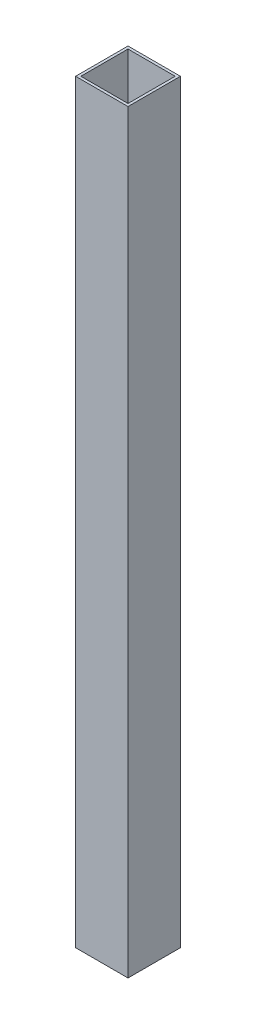
ISO-10303-21;
HEADER;
FILE_DESCRIPTION(('STEP AP214'),'2;1');
FILE_NAME('part.step','',(''),(''),'','','');
FILE_SCHEMA(('AUTOMOTIVE_DESIGN { 1 0 10303 214 1 1 1 1 }'));
ENDSEC;
DATA;
#1=APPLICATION_CONTEXT('core data for automotive mechanical design processes');
#2=APPLICATION_PROTOCOL_DEFINITION('international standard','automotive_design',2000,#1);
#3=PRODUCT_CONTEXT('',#1,'mechanical');
#4=PRODUCT('Part','Part','',(#3));
#5=PRODUCT_RELATED_PRODUCT_CATEGORY('part','',(#4));
#6=PRODUCT_DEFINITION_FORMATION('','',#4);
#7=PRODUCT_DEFINITION_CONTEXT('part definition',#1,'design');
#8=PRODUCT_DEFINITION('design','',#6,#7);
#9=PRODUCT_DEFINITION_SHAPE('','',#8);
#10=(LENGTH_UNIT() NAMED_UNIT(*) SI_UNIT(.MILLI.,.METRE.));
#11=(NAMED_UNIT(*) PLANE_ANGLE_UNIT() SI_UNIT($,.RADIAN.));
#12=(NAMED_UNIT(*) SI_UNIT($,.STERADIAN.) SOLID_ANGLE_UNIT());
#13=UNCERTAINTY_MEASURE_WITH_UNIT(LENGTH_MEASURE(1.E-05),#10,'distance_accuracy_value','');
#14=(GEOMETRIC_REPRESENTATION_CONTEXT(3) GLOBAL_UNCERTAINTY_ASSIGNED_CONTEXT((#13)) GLOBAL_UNIT_ASSIGNED_CONTEXT((#10,
#11,#12)) REPRESENTATION_CONTEXT('',''));
#15=CARTESIAN_POINT('',(0.,0.,0.));
#16=DIRECTION('',(0.,0.,1.));
#17=DIRECTION('',(1.,0.,0.));
#18=AXIS2_PLACEMENT_3D('',#15,#16,#17);
#19=CARTESIAN_POINT('',(0.,360.,0.));
#20=DIRECTION('',(0.,1.,0.));
#21=DIRECTION('',(0.,0.,1.));
#22=AXIS2_PLACEMENT_3D('',#19,#20,#21);
#23=PLANE('',#22);
#24=DIRECTION('',(0.,0.,-1.));
#25=VECTOR('',#24,1.);
#26=CARTESIAN_POINT('',(12.5,360.,-12.5));
#27=LINE('',#26,#25);
#28=CARTESIAN_POINT('',(12.5,360.,12.5));
#29=VERTEX_POINT('',#28);
#30=CARTESIAN_POINT('',(12.5,360.,-12.5));
#31=VERTEX_POINT('',#30);
#32=EDGE_CURVE('E136',#29,#31,#27,.T.);
#33=ORIENTED_EDGE('',*,*,#32,.T.);
#34=DIRECTION('',(-1.,0.,0.));
#35=VECTOR('',#34,1.);
#36=CARTESIAN_POINT('',(-12.5,360.,-12.5));
#37=LINE('',#36,#35);
#38=CARTESIAN_POINT('',(-12.5,360.,-12.5));
#39=VERTEX_POINT('',#38);
#40=EDGE_CURVE('E139',#31,#39,#37,.T.);
#41=ORIENTED_EDGE('',*,*,#40,.T.);
#42=DIRECTION('',(0.,0.,1.));
#43=VECTOR('',#42,1.);
#44=CARTESIAN_POINT('',(-12.5,360.,-12.5));
#45=LINE('',#44,#43);
#46=CARTESIAN_POINT('',(-12.5,360.,12.5));
#47=VERTEX_POINT('',#46);
#48=EDGE_CURVE('E142',#39,#47,#45,.T.);
#49=ORIENTED_EDGE('',*,*,#48,.T.);
#50=DIRECTION('',(1.,0.,0.));
#51=VECTOR('',#50,1.);
#52=CARTESIAN_POINT('',(-12.5,360.,12.5));
#53=LINE('',#52,#51);
#54=EDGE_CURVE('E144',#47,#29,#53,.T.);
#55=ORIENTED_EDGE('',*,*,#54,.T.);
#56=EDGE_LOOP('',(#33,#41,#49,#55));
#57=FACE_BOUND('',#56,.T.);
#58=DIRECTION('',(1.,0.,0.));
#59=VECTOR('',#58,1.);
#60=CARTESIAN_POINT('',(11.2504266533904,360.,11.2504266533904));
#61=LINE('',#60,#59);
#62=CARTESIAN_POINT('',(-11.2504266533904,360.,11.2504266533904));
#63=VERTEX_POINT('',#62);
#64=CARTESIAN_POINT('',(11.2504266533904,360.,11.2504266533904));
#65=VERTEX_POINT('',#64);
#66=EDGE_CURVE('E108',#63,#65,#61,.T.);
#67=ORIENTED_EDGE('',*,*,#66,.F.);
#68=DIRECTION('',(0.,0.,1.));
#69=VECTOR('',#68,1.);
#70=CARTESIAN_POINT('',(-11.2504266533904,360.,-11.2504266533904));
#71=LINE('',#70,#69);
#72=CARTESIAN_POINT('',(-11.2504266533904,360.,-11.2504266533904));
#73=VERTEX_POINT('',#72);
#74=EDGE_CURVE('E100',#73,#63,#71,.T.);
#75=ORIENTED_EDGE('',*,*,#74,.F.);
#76=DIRECTION('',(-1.,0.,0.));
#77=VECTOR('',#76,1.);
#78=CARTESIAN_POINT('',(11.2504266533904,360.,-11.2504266533904));
#79=LINE('',#78,#77);
#80=CARTESIAN_POINT('',(11.2504266533904,360.,-11.2504266533904));
#81=VERTEX_POINT('',#80);
#82=EDGE_CURVE('E122',#81,#73,#79,.T.);
#83=ORIENTED_EDGE('',*,*,#82,.F.);
#84=DIRECTION('',(0.,0.,-1.));
#85=VECTOR('',#84,1.);
#86=CARTESIAN_POINT('',(11.2504266533904,360.,-11.2504266533904));
#87=LINE('',#86,#85);
#88=EDGE_CURVE('E120',#65,#81,#87,.T.);
#89=ORIENTED_EDGE('',*,*,#88,.F.);
#90=EDGE_LOOP('',(#67,#75,#83,#89));
#91=FACE_BOUND('',#90,.T.);
#92=ADVANCED_FACE('F35',(#57,#91),#23,.T.);
#93=CARTESIAN_POINT('',(0.,0.,0.));
#94=DIRECTION('',(0.,1.,0.));
#95=DIRECTION('',(0.,0.,1.));
#96=AXIS2_PLACEMENT_3D('',#93,#94,#95);
#97=PLANE('',#96);
#98=DIRECTION('',(0.,0.,-1.));
#99=VECTOR('',#98,1.);
#100=CARTESIAN_POINT('',(12.5,0.,-12.5));
#101=LINE('',#100,#99);
#102=CARTESIAN_POINT('',(12.5,0.,12.5));
#103=VERTEX_POINT('',#102);
#104=CARTESIAN_POINT('',(12.5,0.,-12.5));
#105=VERTEX_POINT('',#104);
#106=EDGE_CURVE('E116',#103,#105,#101,.T.);
#107=ORIENTED_EDGE('',*,*,#106,.F.);
#108=DIRECTION('',(1.,0.,0.));
#109=VECTOR('',#108,1.);
#110=CARTESIAN_POINT('',(-12.5,0.,12.5));
#111=LINE('',#110,#109);
#112=CARTESIAN_POINT('',(-12.5,0.,12.5));
#113=VERTEX_POINT('',#112);
#114=EDGE_CURVE('E140',#113,#103,#111,.T.);
#115=ORIENTED_EDGE('',*,*,#114,.F.);
#116=DIRECTION('',(0.,0.,1.));
#117=VECTOR('',#116,1.);
#118=CARTESIAN_POINT('',(-12.5,0.,-12.5));
#119=LINE('',#118,#117);
#120=CARTESIAN_POINT('',(-12.5,0.,-12.5));
#121=VERTEX_POINT('',#120);
#122=EDGE_CURVE('E151',#121,#113,#119,.T.);
#123=ORIENTED_EDGE('',*,*,#122,.F.);
#124=DIRECTION('',(-1.,0.,0.));
#125=VECTOR('',#124,1.);
#126=CARTESIAN_POINT('',(-12.5,0.,-12.5));
#127=LINE('',#126,#125);
#128=EDGE_CURVE('E149',#105,#121,#127,.T.);
#129=ORIENTED_EDGE('',*,*,#128,.F.);
#130=EDGE_LOOP('',(#107,#115,#123,#129));
#131=FACE_BOUND('',#130,.T.);
#132=DIRECTION('',(0.,0.,1.));
#133=VECTOR('',#132,1.);
#134=CARTESIAN_POINT('',(-11.2504266533904,0.,-11.2504266533904));
#135=LINE('',#134,#133);
#136=CARTESIAN_POINT('',(-11.2504266533904,0.,-11.2504266533904));
#137=VERTEX_POINT('',#136);
#138=CARTESIAN_POINT('',(-11.2504266533904,0.,11.2504266533904));
#139=VERTEX_POINT('',#138);
#140=EDGE_CURVE('E58',#137,#139,#135,.T.);
#141=ORIENTED_EDGE('',*,*,#140,.T.);
#142=DIRECTION('',(1.,0.,0.));
#143=VECTOR('',#142,1.);
#144=CARTESIAN_POINT('',(11.2504266533904,0.,11.2504266533904));
#145=LINE('',#144,#143);
#146=CARTESIAN_POINT('',(11.2504266533904,0.,11.2504266533904));
#147=VERTEX_POINT('',#146);
#148=EDGE_CURVE('E115',#139,#147,#145,.T.);
#149=ORIENTED_EDGE('',*,*,#148,.T.);
#150=DIRECTION('',(0.,0.,-1.));
#151=VECTOR('',#150,1.);
#152=CARTESIAN_POINT('',(11.2504266533904,0.,-11.2504266533904));
#153=LINE('',#152,#151);
#154=CARTESIAN_POINT('',(11.2504266533904,0.,-11.2504266533904));
#155=VERTEX_POINT('',#154);
#156=EDGE_CURVE('E128',#147,#155,#153,.T.);
#157=ORIENTED_EDGE('',*,*,#156,.T.);
#158=DIRECTION('',(-1.,0.,0.));
#159=VECTOR('',#158,1.);
#160=CARTESIAN_POINT('',(11.2504266533904,0.,-11.2504266533904));
#161=LINE('',#160,#159);
#162=EDGE_CURVE('E109',#155,#137,#161,.T.);
#163=ORIENTED_EDGE('',*,*,#162,.T.);
#164=EDGE_LOOP('',(#141,#149,#157,#163));
#165=FACE_BOUND('',#164,.T.);
#166=ADVANCED_FACE('F169',(#131,#165),#97,.F.);
#167=CARTESIAN_POINT('',(12.5,360.,-12.5));
#168=DIRECTION('',(-1.,0.,0.));
#169=DIRECTION('',(0.,0.,1.));
#170=AXIS2_PLACEMENT_3D('',#167,#168,#169);
#171=PLANE('',#170);
#172=ORIENTED_EDGE('',*,*,#106,.T.);
#173=DIRECTION('',(0.,-1.,0.));
#174=VECTOR('',#173,1.);
#175=CARTESIAN_POINT('',(12.5,360.,-12.5));
#176=LINE('',#175,#174);
#177=EDGE_CURVE('E11',#31,#105,#176,.T.);
#178=ORIENTED_EDGE('',*,*,#177,.F.);
#179=ORIENTED_EDGE('',*,*,#32,.F.);
#180=DIRECTION('',(0.,-1.,0.));
#181=VECTOR('',#180,1.);
#182=CARTESIAN_POINT('',(12.5,360.,12.5));
#183=LINE('',#182,#181);
#184=EDGE_CURVE('E146',#29,#103,#183,.T.);
#185=ORIENTED_EDGE('',*,*,#184,.T.);
#186=EDGE_LOOP('',(#172,#178,#179,#185));
#187=FACE_BOUND('',#186,.T.);
#188=ADVANCED_FACE('F37',(#187),#171,.F.);
#189=CARTESIAN_POINT('',(-12.5,360.,-12.5));
#190=DIRECTION('',(0.,0.,1.));
#191=DIRECTION('',(1.,0.,0.));
#192=AXIS2_PLACEMENT_3D('',#189,#190,#191);
#193=PLANE('',#192);
#194=ORIENTED_EDGE('',*,*,#128,.T.);
#195=DIRECTION('',(0.,-1.,0.));
#196=VECTOR('',#195,1.);
#197=CARTESIAN_POINT('',(-12.5,360.,-12.5));
#198=LINE('',#197,#196);
#199=EDGE_CURVE('E43',#39,#121,#198,.T.);
#200=ORIENTED_EDGE('',*,*,#199,.F.);
#201=ORIENTED_EDGE('',*,*,#40,.F.);
#202=ORIENTED_EDGE('',*,*,#177,.T.);
#203=EDGE_LOOP('',(#194,#200,#201,#202));
#204=FACE_BOUND('',#203,.T.);
#205=ADVANCED_FACE('F179',(#204),#193,.F.);
#206=CARTESIAN_POINT('',(-12.5,360.,-12.5));
#207=DIRECTION('',(1.,0.,0.));
#208=DIRECTION('',(0.,0.,-1.));
#209=AXIS2_PLACEMENT_3D('',#206,#207,#208);
#210=PLANE('',#209);
#211=ORIENTED_EDGE('',*,*,#122,.T.);
#212=DIRECTION('',(0.,-1.,0.));
#213=VECTOR('',#212,1.);
#214=CARTESIAN_POINT('',(-12.5,360.,12.5));
#215=LINE('',#214,#213);
#216=EDGE_CURVE('E156',#47,#113,#215,.T.);
#217=ORIENTED_EDGE('',*,*,#216,.F.);
#218=ORIENTED_EDGE('',*,*,#48,.F.);
#219=ORIENTED_EDGE('',*,*,#199,.T.);
#220=EDGE_LOOP('',(#211,#217,#218,#219));
#221=FACE_BOUND('',#220,.T.);
#222=ADVANCED_FACE('F163',(#221),#210,.F.);
#223=CARTESIAN_POINT('',(-12.5,360.,12.5));
#224=DIRECTION('',(0.,0.,-1.));
#225=DIRECTION('',(-1.,0.,0.));
#226=AXIS2_PLACEMENT_3D('',#223,#224,#225);
#227=PLANE('',#226);
#228=ORIENTED_EDGE('',*,*,#114,.T.);
#229=ORIENTED_EDGE('',*,*,#184,.F.);
#230=ORIENTED_EDGE('',*,*,#54,.F.);
#231=ORIENTED_EDGE('',*,*,#216,.T.);
#232=EDGE_LOOP('',(#228,#229,#230,#231));
#233=FACE_BOUND('',#232,.T.);
#234=ADVANCED_FACE('F173',(#233),#227,.F.);
#235=CARTESIAN_POINT('',(-11.2504266533904,360.,-11.2504266533904));
#236=DIRECTION('',(1.,0.,0.));
#237=DIRECTION('',(0.,0.,-1.));
#238=AXIS2_PLACEMENT_3D('',#235,#236,#237);
#239=PLANE('',#238);
#240=ORIENTED_EDGE('',*,*,#140,.F.);
#241=DIRECTION('',(0.,-1.,0.));
#242=VECTOR('',#241,1.);
#243=CARTESIAN_POINT('',(-11.2504266533904,360.,-11.2504266533904));
#244=LINE('',#243,#242);
#245=EDGE_CURVE('E104',#73,#137,#244,.T.);
#246=ORIENTED_EDGE('',*,*,#245,.F.);
#247=ORIENTED_EDGE('',*,*,#74,.T.);
#248=DIRECTION('',(0.,-1.,0.));
#249=VECTOR('',#248,1.);
#250=CARTESIAN_POINT('',(-11.2504266533904,360.,11.2504266533904));
#251=LINE('',#250,#249);
#252=EDGE_CURVE('E103',#63,#139,#251,.T.);
#253=ORIENTED_EDGE('',*,*,#252,.T.);
#254=EDGE_LOOP('',(#240,#246,#247,#253));
#255=FACE_BOUND('',#254,.T.);
#256=ADVANCED_FACE('F102',(#255),#239,.T.);
#257=CARTESIAN_POINT('',(11.2504266533904,360.,11.2504266533904));
#258=DIRECTION('',(0.,0.,-1.));
#259=DIRECTION('',(-1.,0.,0.));
#260=AXIS2_PLACEMENT_3D('',#257,#258,#259);
#261=PLANE('',#260);
#262=ORIENTED_EDGE('',*,*,#148,.F.);
#263=ORIENTED_EDGE('',*,*,#252,.F.);
#264=ORIENTED_EDGE('',*,*,#66,.T.);
#265=DIRECTION('',(0.,-1.,0.));
#266=VECTOR('',#265,1.);
#267=CARTESIAN_POINT('',(11.2504266533904,360.,11.2504266533904));
#268=LINE('',#267,#266);
#269=EDGE_CURVE('E117',#65,#147,#268,.T.);
#270=ORIENTED_EDGE('',*,*,#269,.T.);
#271=EDGE_LOOP('',(#262,#263,#264,#270));
#272=FACE_BOUND('',#271,.T.);
#273=ADVANCED_FACE('F112',(#272),#261,.T.);
#274=CARTESIAN_POINT('',(11.2504266533904,360.,-11.2504266533904));
#275=DIRECTION('',(-1.,0.,0.));
#276=DIRECTION('',(0.,0.,1.));
#277=AXIS2_PLACEMENT_3D('',#274,#275,#276);
#278=PLANE('',#277);
#279=ORIENTED_EDGE('',*,*,#156,.F.);
#280=ORIENTED_EDGE('',*,*,#269,.F.);
#281=ORIENTED_EDGE('',*,*,#88,.T.);
#282=DIRECTION('',(0.,-1.,0.));
#283=VECTOR('',#282,1.);
#284=CARTESIAN_POINT('',(11.2504266533904,360.,-11.2504266533904));
#285=LINE('',#284,#283);
#286=EDGE_CURVE('E50',#81,#155,#285,.T.);
#287=ORIENTED_EDGE('',*,*,#286,.T.);
#288=EDGE_LOOP('',(#279,#280,#281,#287));
#289=FACE_BOUND('',#288,.T.);
#290=ADVANCED_FACE('F202',(#289),#278,.T.);
#291=CARTESIAN_POINT('',(11.2504266533904,360.,-11.2504266533904));
#292=DIRECTION('',(0.,0.,1.));
#293=DIRECTION('',(1.,0.,0.));
#294=AXIS2_PLACEMENT_3D('',#291,#292,#293);
#295=PLANE('',#294);
#296=ORIENTED_EDGE('',*,*,#162,.F.);
#297=ORIENTED_EDGE('',*,*,#286,.F.);
#298=ORIENTED_EDGE('',*,*,#82,.T.);
#299=ORIENTED_EDGE('',*,*,#245,.T.);
#300=EDGE_LOOP('',(#296,#297,#298,#299));
#301=FACE_BOUND('',#300,.T.);
#302=ADVANCED_FACE('F206',(#301),#295,.T.);
#303=CLOSED_SHELL('',(#92,#166,#188,#205,#222,#234,#256,#273,#290,#302));
#304=MANIFOLD_SOLID_BREP('B2',#303);
#305=ADVANCED_BREP_SHAPE_REPRESENTATION('',(#18,#304),#14);
#306=SHAPE_DEFINITION_REPRESENTATION(#9,#305);
ENDSEC;
END-ISO-10303-21;
